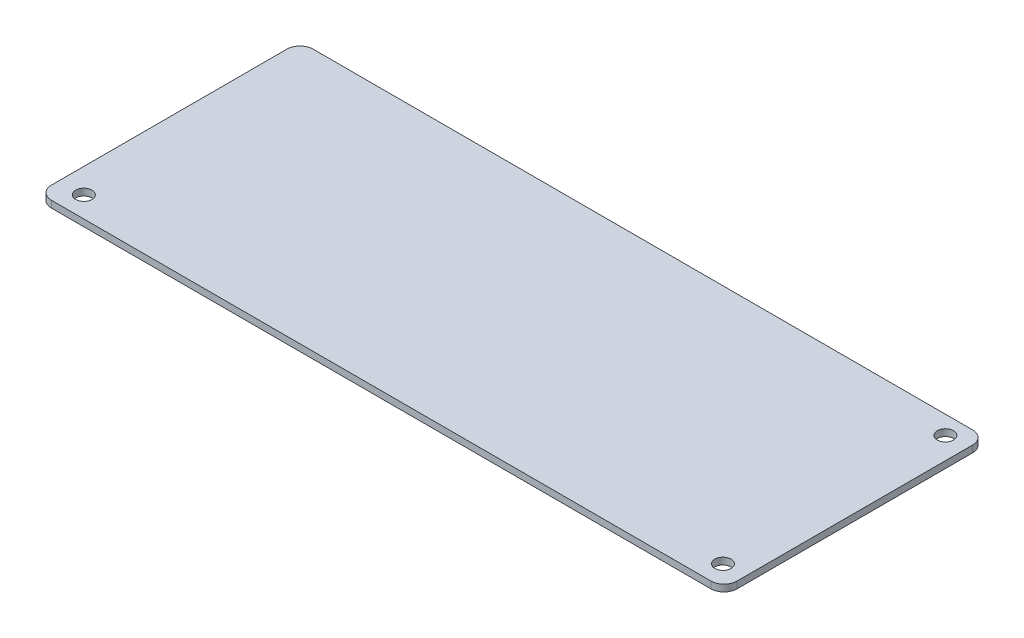
ISO-10303-21;
HEADER;
FILE_DESCRIPTION(('STEP AP214'),'2;1');
FILE_NAME('part.step','',(''),(''),'','','');
FILE_SCHEMA(('AUTOMOTIVE_DESIGN { 1 0 10303 214 1 1 1 1 }'));
ENDSEC;
DATA;
#1=APPLICATION_CONTEXT('core data for automotive mechanical design processes');
#2=APPLICATION_PROTOCOL_DEFINITION('international standard','automotive_design',2000,#1);
#3=PRODUCT_CONTEXT('',#1,'mechanical');
#4=PRODUCT('Part','Part','',(#3));
#5=PRODUCT_RELATED_PRODUCT_CATEGORY('part','',(#4));
#6=PRODUCT_DEFINITION_FORMATION('','',#4);
#7=PRODUCT_DEFINITION_CONTEXT('part definition',#1,'design');
#8=PRODUCT_DEFINITION('design','',#6,#7);
#9=PRODUCT_DEFINITION_SHAPE('','',#8);
#10=(LENGTH_UNIT() NAMED_UNIT(*) SI_UNIT(.MILLI.,.METRE.));
#11=(NAMED_UNIT(*) PLANE_ANGLE_UNIT() SI_UNIT($,.RADIAN.));
#12=(NAMED_UNIT(*) SI_UNIT($,.STERADIAN.) SOLID_ANGLE_UNIT());
#13=UNCERTAINTY_MEASURE_WITH_UNIT(LENGTH_MEASURE(1.E-05),#10,'distance_accuracy_value','');
#14=(GEOMETRIC_REPRESENTATION_CONTEXT(3) GLOBAL_UNCERTAINTY_ASSIGNED_CONTEXT((#13)) GLOBAL_UNIT_ASSIGNED_CONTEXT((#10,
#11,#12)) REPRESENTATION_CONTEXT('',''));
#15=CARTESIAN_POINT('',(0.,0.,0.));
#16=DIRECTION('',(0.,0.,1.));
#17=DIRECTION('',(1.,0.,0.));
#18=AXIS2_PLACEMENT_3D('',#15,#16,#17);
#19=CARTESIAN_POINT('',(-63.,1.3,-22.5));
#20=DIRECTION('',(0.,-1.,0.));
#21=DIRECTION('',(0.,0.,-1.));
#22=AXIS2_PLACEMENT_3D('',#19,#20,#21);
#23=CYLINDRICAL_SURFACE('',#22,2.5);
#24=CARTESIAN_POINT('',(-63.,0.,-22.5));
#25=DIRECTION('',(0.,1.,0.));
#26=DIRECTION('',(0.,0.,1.));
#27=AXIS2_PLACEMENT_3D('',#24,#25,#26);
#28=CIRCLE('',#27,2.5);
#29=CARTESIAN_POINT('',(-63.,0.,-25.));
#30=VERTEX_POINT('',#29);
#31=CARTESIAN_POINT('',(-65.5,0.,-22.5));
#32=VERTEX_POINT('',#31);
#33=EDGE_CURVE('E131',#30,#32,#28,.T.);
#34=ORIENTED_EDGE('',*,*,#33,.T.);
#35=DIRECTION('',(0.,-1.,0.));
#36=VECTOR('',#35,1.);
#37=CARTESIAN_POINT('',(-65.5,1.3,-22.5));
#38=LINE('',#37,#36);
#39=CARTESIAN_POINT('',(-65.5,1.3,-22.5));
#40=VERTEX_POINT('',#39);
#41=EDGE_CURVE('E11',#40,#32,#38,.T.);
#42=ORIENTED_EDGE('',*,*,#41,.F.);
#43=CARTESIAN_POINT('',(-63.,1.3,-22.5));
#44=DIRECTION('',(0.,1.,0.));
#45=DIRECTION('',(0.,0.,1.));
#46=AXIS2_PLACEMENT_3D('',#43,#44,#45);
#47=CIRCLE('',#46,2.5);
#48=CARTESIAN_POINT('',(-63.,1.3,-25.));
#49=VERTEX_POINT('',#48);
#50=EDGE_CURVE('E146',#49,#40,#47,.T.);
#51=ORIENTED_EDGE('',*,*,#50,.F.);
#52=DIRECTION('',(0.,-1.,0.));
#53=VECTOR('',#52,1.);
#54=CARTESIAN_POINT('',(-63.,1.3,-25.));
#55=LINE('',#54,#53);
#56=EDGE_CURVE('E127',#49,#30,#55,.T.);
#57=ORIENTED_EDGE('',*,*,#56,.T.);
#58=EDGE_LOOP('',(#34,#42,#51,#57));
#59=FACE_BOUND('',#58,.T.);
#60=ADVANCED_FACE('F33',(#59),#23,.T.);
#61=CARTESIAN_POINT('',(-65.5,1.3,22.5));
#62=DIRECTION('',(1.,0.,0.));
#63=DIRECTION('',(0.,0.,-1.));
#64=AXIS2_PLACEMENT_3D('',#61,#62,#63);
#65=PLANE('',#64);
#66=DIRECTION('',(0.,0.,1.));
#67=VECTOR('',#66,1.);
#68=CARTESIAN_POINT('',(-65.5,0.,22.5));
#69=LINE('',#68,#67);
#70=CARTESIAN_POINT('',(-65.5,0.,22.5));
#71=VERTEX_POINT('',#70);
#72=EDGE_CURVE('E134',#32,#71,#69,.T.);
#73=ORIENTED_EDGE('',*,*,#72,.T.);
#74=DIRECTION('',(0.,-1.,0.));
#75=VECTOR('',#74,1.);
#76=CARTESIAN_POINT('',(-65.5,1.3,22.5));
#77=LINE('',#76,#75);
#78=CARTESIAN_POINT('',(-65.5,1.3,22.5));
#79=VERTEX_POINT('',#78);
#80=EDGE_CURVE('E42',#79,#71,#77,.T.);
#81=ORIENTED_EDGE('',*,*,#80,.F.);
#82=DIRECTION('',(0.,0.,1.));
#83=VECTOR('',#82,1.);
#84=CARTESIAN_POINT('',(-65.5,1.3,22.5));
#85=LINE('',#84,#83);
#86=EDGE_CURVE('E94',#40,#79,#85,.T.);
#87=ORIENTED_EDGE('',*,*,#86,.F.);
#88=ORIENTED_EDGE('',*,*,#41,.T.);
#89=EDGE_LOOP('',(#73,#81,#87,#88));
#90=FACE_BOUND('',#89,.T.);
#91=ADVANCED_FACE('F210',(#90),#65,.F.);
#92=CARTESIAN_POINT('',(-63.,1.3,22.5));
#93=DIRECTION('',(0.,-1.,0.));
#94=DIRECTION('',(0.,0.,-1.));
#95=AXIS2_PLACEMENT_3D('',#92,#93,#94);
#96=CYLINDRICAL_SURFACE('',#95,2.5);
#97=CARTESIAN_POINT('',(-63.,0.,22.5));
#98=DIRECTION('',(0.,1.,0.));
#99=DIRECTION('',(0.,0.,-1.));
#100=AXIS2_PLACEMENT_3D('',#97,#98,#99);
#101=CIRCLE('',#100,2.5);
#102=CARTESIAN_POINT('',(-63.,0.,25.));
#103=VERTEX_POINT('',#102);
#104=EDGE_CURVE('E137',#71,#103,#101,.T.);
#105=ORIENTED_EDGE('',*,*,#104,.T.);
#106=DIRECTION('',(0.,-1.,0.));
#107=VECTOR('',#106,1.);
#108=CARTESIAN_POINT('',(-63.,1.3,25.));
#109=LINE('',#108,#107);
#110=CARTESIAN_POINT('',(-63.,1.3,25.));
#111=VERTEX_POINT('',#110);
#112=EDGE_CURVE('E153',#111,#103,#109,.T.);
#113=ORIENTED_EDGE('',*,*,#112,.F.);
#114=CARTESIAN_POINT('',(-63.,1.3,22.5));
#115=DIRECTION('',(0.,1.,0.));
#116=DIRECTION('',(0.,0.,-1.));
#117=AXIS2_PLACEMENT_3D('',#114,#115,#116);
#118=CIRCLE('',#117,2.5);
#119=EDGE_CURVE('E178',#79,#111,#118,.T.);
#120=ORIENTED_EDGE('',*,*,#119,.F.);
#121=ORIENTED_EDGE('',*,*,#80,.T.);
#122=EDGE_LOOP('',(#105,#113,#120,#121));
#123=FACE_BOUND('',#122,.T.);
#124=ADVANCED_FACE('F214',(#123),#96,.T.);
#125=CARTESIAN_POINT('',(63.,1.3,25.));
#126=DIRECTION('',(0.,0.,-1.));
#127=DIRECTION('',(-1.,0.,0.));
#128=AXIS2_PLACEMENT_3D('',#125,#126,#127);
#129=PLANE('',#128);
#130=DIRECTION('',(1.,0.,0.));
#131=VECTOR('',#130,1.);
#132=CARTESIAN_POINT('',(63.,0.,25.));
#133=LINE('',#132,#131);
#134=CARTESIAN_POINT('',(63.,0.,25.));
#135=VERTEX_POINT('',#134);
#136=EDGE_CURVE('E139',#103,#135,#133,.T.);
#137=ORIENTED_EDGE('',*,*,#136,.T.);
#138=DIRECTION('',(0.,-1.,0.));
#139=VECTOR('',#138,1.);
#140=CARTESIAN_POINT('',(63.,1.3,25.));
#141=LINE('',#140,#139);
#142=CARTESIAN_POINT('',(63.,1.3,25.));
#143=VERTEX_POINT('',#142);
#144=EDGE_CURVE('E150',#143,#135,#141,.T.);
#145=ORIENTED_EDGE('',*,*,#144,.F.);
#146=DIRECTION('',(1.,0.,0.));
#147=VECTOR('',#146,1.);
#148=CARTESIAN_POINT('',(63.,1.3,25.));
#149=LINE('',#148,#147);
#150=EDGE_CURVE('E180',#111,#143,#149,.T.);
#151=ORIENTED_EDGE('',*,*,#150,.F.);
#152=ORIENTED_EDGE('',*,*,#112,.T.);
#153=EDGE_LOOP('',(#137,#145,#151,#152));
#154=FACE_BOUND('',#153,.T.);
#155=ADVANCED_FACE('F186',(#154),#129,.F.);
#156=CARTESIAN_POINT('',(63.,1.3,22.5));
#157=DIRECTION('',(0.,-1.,0.));
#158=DIRECTION('',(0.,0.,-1.));
#159=AXIS2_PLACEMENT_3D('',#156,#157,#158);
#160=CYLINDRICAL_SURFACE('',#159,2.5);
#161=CARTESIAN_POINT('',(63.,0.,22.5));
#162=DIRECTION('',(0.,1.,0.));
#163=DIRECTION('',(0.,0.,1.));
#164=AXIS2_PLACEMENT_3D('',#161,#162,#163);
#165=CIRCLE('',#164,2.5);
#166=CARTESIAN_POINT('',(65.5,0.,22.5));
#167=VERTEX_POINT('',#166);
#168=EDGE_CURVE('E141',#135,#167,#165,.T.);
#169=ORIENTED_EDGE('',*,*,#168,.T.);
#170=DIRECTION('',(0.,-1.,0.));
#171=VECTOR('',#170,1.);
#172=CARTESIAN_POINT('',(65.5,1.3,22.5));
#173=LINE('',#172,#171);
#174=CARTESIAN_POINT('',(65.5,1.3,22.5));
#175=VERTEX_POINT('',#174);
#176=EDGE_CURVE('E122',#175,#167,#173,.T.);
#177=ORIENTED_EDGE('',*,*,#176,.F.);
#178=CARTESIAN_POINT('',(63.,1.3,22.5));
#179=DIRECTION('',(0.,1.,0.));
#180=DIRECTION('',(0.,0.,1.));
#181=AXIS2_PLACEMENT_3D('',#178,#179,#180);
#182=CIRCLE('',#181,2.5);
#183=EDGE_CURVE('E113',#143,#175,#182,.T.);
#184=ORIENTED_EDGE('',*,*,#183,.F.);
#185=ORIENTED_EDGE('',*,*,#144,.T.);
#186=EDGE_LOOP('',(#169,#177,#184,#185));
#187=FACE_BOUND('',#186,.T.);
#188=ADVANCED_FACE('F190',(#187),#160,.T.);
#189=CARTESIAN_POINT('',(65.5,1.3,22.5));
#190=DIRECTION('',(-1.,0.,0.));
#191=DIRECTION('',(0.,0.,1.));
#192=AXIS2_PLACEMENT_3D('',#189,#190,#191);
#193=PLANE('',#192);
#194=DIRECTION('',(0.,0.,-1.));
#195=VECTOR('',#194,1.);
#196=CARTESIAN_POINT('',(65.5,0.,22.5));
#197=LINE('',#196,#195);
#198=CARTESIAN_POINT('',(65.5,0.,-22.5));
#199=VERTEX_POINT('',#198);
#200=EDGE_CURVE('E121',#167,#199,#197,.T.);
#201=ORIENTED_EDGE('',*,*,#200,.T.);
#202=DIRECTION('',(0.,-1.,0.));
#203=VECTOR('',#202,1.);
#204=CARTESIAN_POINT('',(65.5,1.3,-22.5));
#205=LINE('',#204,#203);
#206=CARTESIAN_POINT('',(65.5,1.3,-22.5));
#207=VERTEX_POINT('',#206);
#208=EDGE_CURVE('E118',#207,#199,#205,.T.);
#209=ORIENTED_EDGE('',*,*,#208,.F.);
#210=DIRECTION('',(0.,0.,-1.));
#211=VECTOR('',#210,1.);
#212=CARTESIAN_POINT('',(65.5,1.3,22.5));
#213=LINE('',#212,#211);
#214=EDGE_CURVE('E107',#175,#207,#213,.T.);
#215=ORIENTED_EDGE('',*,*,#214,.F.);
#216=ORIENTED_EDGE('',*,*,#176,.T.);
#217=EDGE_LOOP('',(#201,#209,#215,#216));
#218=FACE_BOUND('',#217,.T.);
#219=ADVANCED_FACE('F119',(#218),#193,.F.);
#220=CARTESIAN_POINT('',(63.,1.3,-22.5));
#221=DIRECTION('',(0.,-1.,0.));
#222=DIRECTION('',(0.,0.,-1.));
#223=AXIS2_PLACEMENT_3D('',#220,#221,#222);
#224=CYLINDRICAL_SURFACE('',#223,2.5);
#225=CARTESIAN_POINT('',(63.,0.,-22.5));
#226=DIRECTION('',(0.,1.,0.));
#227=DIRECTION('',(0.,0.,1.));
#228=AXIS2_PLACEMENT_3D('',#225,#226,#227);
#229=CIRCLE('',#228,2.5);
#230=CARTESIAN_POINT('',(63.,0.,-25.));
#231=VERTEX_POINT('',#230);
#232=EDGE_CURVE('E80',#199,#231,#229,.T.);
#233=ORIENTED_EDGE('',*,*,#232,.T.);
#234=DIRECTION('',(0.,-1.,0.));
#235=VECTOR('',#234,1.);
#236=CARTESIAN_POINT('',(63.,1.3,-25.));
#237=LINE('',#236,#235);
#238=CARTESIAN_POINT('',(63.,1.3,-25.));
#239=VERTEX_POINT('',#238);
#240=EDGE_CURVE('E123',#239,#231,#237,.T.);
#241=ORIENTED_EDGE('',*,*,#240,.F.);
#242=CARTESIAN_POINT('',(63.,1.3,-22.5));
#243=DIRECTION('',(0.,1.,0.));
#244=DIRECTION('',(0.,0.,1.));
#245=AXIS2_PLACEMENT_3D('',#242,#243,#244);
#246=CIRCLE('',#245,2.5);
#247=EDGE_CURVE('E111',#207,#239,#246,.T.);
#248=ORIENTED_EDGE('',*,*,#247,.F.);
#249=ORIENTED_EDGE('',*,*,#208,.T.);
#250=EDGE_LOOP('',(#233,#241,#248,#249));
#251=FACE_BOUND('',#250,.T.);
#252=ADVANCED_FACE('F125',(#251),#224,.T.);
#253=CARTESIAN_POINT('',(63.,1.3,-25.));
#254=DIRECTION('',(0.,0.,1.));
#255=DIRECTION('',(1.,0.,0.));
#256=AXIS2_PLACEMENT_3D('',#253,#254,#255);
#257=PLANE('',#256);
#258=DIRECTION('',(-1.,0.,0.));
#259=VECTOR('',#258,1.);
#260=CARTESIAN_POINT('',(63.,0.,-25.));
#261=LINE('',#260,#259);
#262=EDGE_CURVE('E86',#231,#30,#261,.T.);
#263=ORIENTED_EDGE('',*,*,#262,.T.);
#264=ORIENTED_EDGE('',*,*,#56,.F.);
#265=DIRECTION('',(-1.,0.,0.));
#266=VECTOR('',#265,1.);
#267=CARTESIAN_POINT('',(63.,1.3,-25.));
#268=LINE('',#267,#266);
#269=EDGE_CURVE('E51',#239,#49,#268,.T.);
#270=ORIENTED_EDGE('',*,*,#269,.F.);
#271=ORIENTED_EDGE('',*,*,#240,.T.);
#272=EDGE_LOOP('',(#263,#264,#270,#271));
#273=FACE_BOUND('',#272,.T.);
#274=ADVANCED_FACE('F198',(#273),#257,.F.);
#275=CARTESIAN_POINT('',(-63.,1.3,-22.5));
#276=DIRECTION('',(0.,1.,0.));
#277=DIRECTION('',(0.,0.,1.));
#278=AXIS2_PLACEMENT_3D('',#275,#276,#277);
#279=PLANE('',#278);
#280=CARTESIAN_POINT('',(61.3,1.3,-21.5));
#281=DIRECTION('',(0.,1.,0.));
#282=DIRECTION('',(0.,0.,1.));
#283=AXIS2_PLACEMENT_3D('',#280,#281,#282);
#284=CIRCLE('',#283,1.54999999999999);
#285=CARTESIAN_POINT('',(61.3,1.3,-19.95));
#286=VERTEX_POINT('',#285);
#287=EDGE_CURVE('E162',#286,#286,#284,.T.);
#288=ORIENTED_EDGE('',*,*,#287,.F.);
#289=EDGE_LOOP('',(#288));
#290=FACE_BOUND('',#289,.T.);
#291=CARTESIAN_POINT('',(61.3,1.3,21.));
#292=DIRECTION('',(0.,1.,0.));
#293=DIRECTION('',(0.,0.,1.));
#294=AXIS2_PLACEMENT_3D('',#291,#292,#293);
#295=CIRCLE('',#294,1.55);
#296=CARTESIAN_POINT('',(61.3,1.3,22.55));
#297=VERTEX_POINT('',#296);
#298=EDGE_CURVE('E167',#297,#297,#295,.T.);
#299=ORIENTED_EDGE('',*,*,#298,.F.);
#300=EDGE_LOOP('',(#299));
#301=FACE_BOUND('',#300,.T.);
#302=CARTESIAN_POINT('',(-60.8,1.3,21.));
#303=DIRECTION('',(0.,1.,0.));
#304=DIRECTION('',(0.,0.,1.));
#305=AXIS2_PLACEMENT_3D('',#302,#303,#304);
#306=CIRCLE('',#305,1.55);
#307=CARTESIAN_POINT('',(-60.8,1.3,22.55));
#308=VERTEX_POINT('',#307);
#309=EDGE_CURVE('E159',#308,#308,#306,.T.);
#310=ORIENTED_EDGE('',*,*,#309,.F.);
#311=EDGE_LOOP('',(#310));
#312=FACE_BOUND('',#311,.T.);
#313=ORIENTED_EDGE('',*,*,#50,.T.);
#314=ORIENTED_EDGE('',*,*,#86,.T.);
#315=ORIENTED_EDGE('',*,*,#119,.T.);
#316=ORIENTED_EDGE('',*,*,#150,.T.);
#317=ORIENTED_EDGE('',*,*,#183,.T.);
#318=ORIENTED_EDGE('',*,*,#214,.T.);
#319=ORIENTED_EDGE('',*,*,#247,.T.);
#320=ORIENTED_EDGE('',*,*,#269,.T.);
#321=EDGE_LOOP('',(#313,#314,#315,#316,#317,#318,#319,#320));
#322=FACE_BOUND('',#321,.T.);
#323=ADVANCED_FACE('F109',(#290,#301,#312,#322),#279,.T.);
#324=CARTESIAN_POINT('',(-63.,0.,-22.5));
#325=DIRECTION('',(0.,1.,0.));
#326=DIRECTION('',(0.,0.,1.));
#327=AXIS2_PLACEMENT_3D('',#324,#325,#326);
#328=PLANE('',#327);
#329=CARTESIAN_POINT('',(61.3,0.,-21.5));
#330=DIRECTION('',(0.,1.,0.));
#331=DIRECTION('',(0.,0.,1.));
#332=AXIS2_PLACEMENT_3D('',#329,#330,#331);
#333=CIRCLE('',#332,1.54999999999999);
#334=CARTESIAN_POINT('',(61.3,0.,-19.95));
#335=VERTEX_POINT('',#334);
#336=EDGE_CURVE('E36',#335,#335,#333,.T.);
#337=ORIENTED_EDGE('',*,*,#336,.T.);
#338=EDGE_LOOP('',(#337));
#339=FACE_BOUND('',#338,.T.);
#340=CARTESIAN_POINT('',(61.3,0.,21.));
#341=DIRECTION('',(0.,1.,0.));
#342=DIRECTION('',(0.,0.,1.));
#343=AXIS2_PLACEMENT_3D('',#340,#341,#342);
#344=CIRCLE('',#343,1.55);
#345=CARTESIAN_POINT('',(61.3,0.,22.55));
#346=VERTEX_POINT('',#345);
#347=EDGE_CURVE('E160',#346,#346,#344,.T.);
#348=ORIENTED_EDGE('',*,*,#347,.T.);
#349=EDGE_LOOP('',(#348));
#350=FACE_BOUND('',#349,.T.);
#351=CARTESIAN_POINT('',(-60.8,0.,21.));
#352=DIRECTION('',(0.,1.,0.));
#353=DIRECTION('',(0.,0.,1.));
#354=AXIS2_PLACEMENT_3D('',#351,#352,#353);
#355=CIRCLE('',#354,1.55);
#356=CARTESIAN_POINT('',(-60.8,0.,22.55));
#357=VERTEX_POINT('',#356);
#358=EDGE_CURVE('E135',#357,#357,#355,.T.);
#359=ORIENTED_EDGE('',*,*,#358,.T.);
#360=EDGE_LOOP('',(#359));
#361=FACE_BOUND('',#360,.T.);
#362=ORIENTED_EDGE('',*,*,#33,.F.);
#363=ORIENTED_EDGE('',*,*,#262,.F.);
#364=ORIENTED_EDGE('',*,*,#232,.F.);
#365=ORIENTED_EDGE('',*,*,#200,.F.);
#366=ORIENTED_EDGE('',*,*,#168,.F.);
#367=ORIENTED_EDGE('',*,*,#136,.F.);
#368=ORIENTED_EDGE('',*,*,#104,.F.);
#369=ORIENTED_EDGE('',*,*,#72,.F.);
#370=EDGE_LOOP('',(#362,#363,#364,#365,#366,#367,#368,#369));
#371=FACE_BOUND('',#370,.T.);
#372=ADVANCED_FACE('F193',(#339,#350,#361,#371),#328,.F.);
#373=CARTESIAN_POINT('',(-60.8,-4.,21.));
#374=DIRECTION('',(0.,1.,0.));
#375=DIRECTION('',(0.,0.,1.));
#376=AXIS2_PLACEMENT_3D('',#373,#374,#375);
#377=CYLINDRICAL_SURFACE('',#376,1.55);
#378=ORIENTED_EDGE('',*,*,#309,.T.);
#379=EDGE_LOOP('',(#378));
#380=FACE_BOUND('',#379,.T.);
#381=ORIENTED_EDGE('',*,*,#358,.F.);
#382=EDGE_LOOP('',(#381));
#383=FACE_BOUND('',#382,.T.);
#384=ADVANCED_FACE('F253',(#380,#383),#377,.F.);
#385=CARTESIAN_POINT('',(61.3,-4.,21.));
#386=DIRECTION('',(0.,1.,0.));
#387=DIRECTION('',(0.,0.,1.));
#388=AXIS2_PLACEMENT_3D('',#385,#386,#387);
#389=CYLINDRICAL_SURFACE('',#388,1.55);
#390=ORIENTED_EDGE('',*,*,#298,.T.);
#391=EDGE_LOOP('',(#390));
#392=FACE_BOUND('',#391,.T.);
#393=ORIENTED_EDGE('',*,*,#347,.F.);
#394=EDGE_LOOP('',(#393));
#395=FACE_BOUND('',#394,.T.);
#396=ADVANCED_FACE('F262',(#392,#395),#389,.F.);
#397=CARTESIAN_POINT('',(61.3,-4.,-21.5));
#398=DIRECTION('',(0.,1.,0.));
#399=DIRECTION('',(0.,0.,1.));
#400=AXIS2_PLACEMENT_3D('',#397,#398,#399);
#401=CYLINDRICAL_SURFACE('',#400,1.54999999999999);
#402=ORIENTED_EDGE('',*,*,#287,.T.);
#403=EDGE_LOOP('',(#402));
#404=FACE_BOUND('',#403,.T.);
#405=ORIENTED_EDGE('',*,*,#336,.F.);
#406=EDGE_LOOP('',(#405));
#407=FACE_BOUND('',#406,.T.);
#408=ADVANCED_FACE('F272',(#404,#407),#401,.F.);
#409=CLOSED_SHELL('',(#60,#91,#124,#155,#188,#219,#252,#274,#323,#372,#384,#396,#408));
#410=MANIFOLD_SOLID_BREP('B2',#409);
#411=ADVANCED_BREP_SHAPE_REPRESENTATION('',(#18,#410),#14);
#412=SHAPE_DEFINITION_REPRESENTATION(#9,#411);
ENDSEC;
END-ISO-10303-21;
